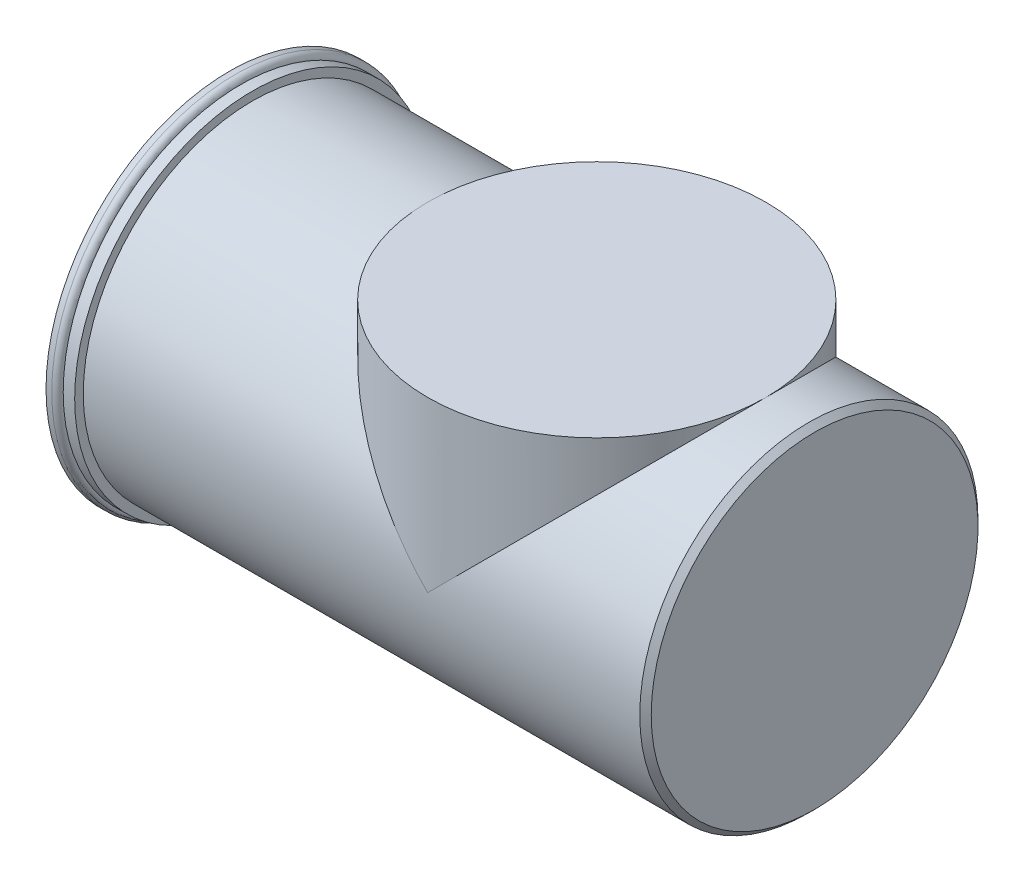
ISO-10303-21;
HEADER;
FILE_DESCRIPTION(('STEP AP214'),'2;1');
FILE_NAME('part.step','',(''),(''),'','','');
FILE_SCHEMA(('AUTOMOTIVE_DESIGN { 1 0 10303 214 1 1 1 1 }'));
ENDSEC;
DATA;
#1=APPLICATION_CONTEXT('core data for automotive mechanical design processes');
#2=APPLICATION_PROTOCOL_DEFINITION('international standard','automotive_design',2000,#1);
#3=PRODUCT_CONTEXT('',#1,'mechanical');
#4=PRODUCT('Part','Part','',(#3));
#5=PRODUCT_RELATED_PRODUCT_CATEGORY('part','',(#4));
#6=PRODUCT_DEFINITION_FORMATION('','',#4);
#7=PRODUCT_DEFINITION_CONTEXT('part definition',#1,'design');
#8=PRODUCT_DEFINITION('design','',#6,#7);
#9=PRODUCT_DEFINITION_SHAPE('','',#8);
#10=(LENGTH_UNIT() NAMED_UNIT(*) SI_UNIT(.MILLI.,.METRE.));
#11=(NAMED_UNIT(*) PLANE_ANGLE_UNIT() SI_UNIT($,.RADIAN.));
#12=(NAMED_UNIT(*) SI_UNIT($,.STERADIAN.) SOLID_ANGLE_UNIT());
#13=UNCERTAINTY_MEASURE_WITH_UNIT(LENGTH_MEASURE(1.E-05),#10,'distance_accuracy_value','');
#14=(GEOMETRIC_REPRESENTATION_CONTEXT(3) GLOBAL_UNCERTAINTY_ASSIGNED_CONTEXT((#13)) GLOBAL_UNIT_ASSIGNED_CONTEXT((#10,
#11,#12)) REPRESENTATION_CONTEXT('',''));
#15=CARTESIAN_POINT('',(0.,0.,0.));
#16=DIRECTION('',(0.,0.,1.));
#17=DIRECTION('',(1.,0.,0.));
#18=AXIS2_PLACEMENT_3D('',#15,#16,#17);
#19=CARTESIAN_POINT('',(-152.589992,0.,0.));
#20=DIRECTION('',(1.,0.,0.));
#21=DIRECTION('',(0.,0.,-1.));
#22=AXIS2_PLACEMENT_3D('',#19,#20,#21);
#23=CYLINDRICAL_SURFACE('',#22,74.93);
#24=CARTESIAN_POINT('',(93.9800000000001,0.,0.));
#25=DIRECTION('',(1.,0.,0.));
#26=DIRECTION('',(0.,0.,-1.));
#27=AXIS2_PLACEMENT_3D('',#24,#25,#26);
#28=CIRCLE('',#27,74.93);
#29=CARTESIAN_POINT('',(93.98,0.,74.93));
#30=VERTEX_POINT('',#29);
#31=EDGE_CURVE('E11',#30,#30,#28,.F.);
#32=ORIENTED_EDGE('',*,*,#31,.T.);
#33=EDGE_LOOP('',(#32));
#34=FACE_BOUND('',#33,.T.);
#35=CARTESIAN_POINT('',(0.,0.,0.));
#36=DIRECTION('',(0.707106781186547,0.707106781186547,0.));
#37=DIRECTION('',(-0.707106781186547,0.707106781186547,0.));
#38=AXIS2_PLACEMENT_3D('',#35,#36,#37);
#39=ELLIPSE('',#38,105.967022228616,74.93);
#40=CARTESIAN_POINT('',(-74.93,74.93,0.));
#41=VERTEX_POINT('',#40);
#42=CARTESIAN_POINT('',(0.,0.,-74.93));
#43=VERTEX_POINT('',#42);
#44=EDGE_CURVE('E57',#41,#43,#39,.F.);
#45=ORIENTED_EDGE('',*,*,#44,.T.);
#46=CARTESIAN_POINT('',(0.,0.,0.));
#47=DIRECTION('',(-0.707106781186547,0.707106781186547,0.));
#48=DIRECTION('',(0.707106781186547,0.707106781186547,0.));
#49=AXIS2_PLACEMENT_3D('',#46,#47,#48);
#50=ELLIPSE('',#49,105.967022228616,74.93);
#51=CARTESIAN_POINT('',(74.93,74.93,0.));
#52=VERTEX_POINT('',#51);
#53=EDGE_CURVE('E83',#43,#52,#50,.F.);
#54=ORIENTED_EDGE('',*,*,#53,.T.);
#55=CARTESIAN_POINT('',(0.,0.,0.));
#56=DIRECTION('',(-0.707106781186547,0.707106781186547,0.));
#57=DIRECTION('',(0.707106781186547,0.707106781186547,0.));
#58=AXIS2_PLACEMENT_3D('',#55,#56,#57);
#59=ELLIPSE('',#58,105.967022228616,74.93);
#60=CARTESIAN_POINT('',(0.,0.,74.93));
#61=VERTEX_POINT('',#60);
#62=EDGE_CURVE('E78',#52,#61,#59,.F.);
#63=ORIENTED_EDGE('',*,*,#62,.T.);
#64=CARTESIAN_POINT('',(0.,0.,0.));
#65=DIRECTION('',(0.707106781186547,0.707106781186547,0.));
#66=DIRECTION('',(-0.707106781186547,0.707106781186547,0.));
#67=AXIS2_PLACEMENT_3D('',#64,#65,#66);
#68=ELLIPSE('',#67,105.967022228616,74.93);
#69=EDGE_CURVE('E62',#61,#41,#68,.F.);
#70=ORIENTED_EDGE('',*,*,#69,.T.);
#71=EDGE_LOOP('',(#45,#54,#63,#70));
#72=FACE_BOUND('',#71,.T.);
#73=CARTESIAN_POINT('',(-152.589992,0.,0.));
#74=DIRECTION('',(-1.,0.,0.));
#75=DIRECTION('',(0.,0.,1.));
#76=AXIS2_PLACEMENT_3D('',#73,#74,#75);
#77=CIRCLE('',#76,74.93);
#78=CARTESIAN_POINT('',(-152.589992,0.,74.93));
#79=VERTEX_POINT('',#78);
#80=EDGE_CURVE('E90',#79,#79,#77,.F.);
#81=ORIENTED_EDGE('',*,*,#80,.T.);
#82=EDGE_LOOP('',(#81));
#83=FACE_BOUND('',#82,.T.);
#84=ADVANCED_FACE('F41',(#34,#72,#83),#23,.T.);
#85=CARTESIAN_POINT('',(96.52,0.,0.));
#86=DIRECTION('',(1.,0.,0.));
#87=DIRECTION('',(0.,0.,-1.));
#88=AXIS2_PLACEMENT_3D('',#85,#86,#87);
#89=PLANE('',#88);
#90=CARTESIAN_POINT('',(96.52,0.,0.));
#91=DIRECTION('',(1.,0.,0.));
#92=DIRECTION('',(0.,0.,-1.));
#93=AXIS2_PLACEMENT_3D('',#90,#91,#92);
#94=CIRCLE('',#93,72.3900000000001);
#95=CARTESIAN_POINT('',(96.52,0.,72.3900000000001));
#96=VERTEX_POINT('',#95);
#97=EDGE_CURVE('E50',#96,#96,#94,.T.);
#98=ORIENTED_EDGE('',*,*,#97,.T.);
#99=EDGE_LOOP('',(#98));
#100=FACE_BOUND('',#99,.T.);
#101=ADVANCED_FACE('F106',(#100),#89,.T.);
#102=CARTESIAN_POINT('',(0.,74.93,0.));
#103=DIRECTION('',(0.,1.,0.));
#104=DIRECTION('',(0.,0.,1.));
#105=AXIS2_PLACEMENT_3D('',#102,#103,#104);
#106=PLANE('',#105);
#107=CARTESIAN_POINT('',(0.,74.93,0.));
#108=DIRECTION('',(0.,1.,0.));
#109=DIRECTION('',(0.,0.,1.));
#110=AXIS2_PLACEMENT_3D('',#107,#108,#109);
#111=CIRCLE('',#110,74.93);
#112=EDGE_CURVE('E70',#41,#52,#111,.T.);
#113=ORIENTED_EDGE('',*,*,#112,.T.);
#114=CARTESIAN_POINT('',(0.,74.93,0.));
#115=DIRECTION('',(0.,1.,0.));
#116=DIRECTION('',(0.,0.,1.));
#117=AXIS2_PLACEMENT_3D('',#114,#115,#116);
#118=CIRCLE('',#117,74.93);
#119=EDGE_CURVE('E74',#52,#41,#118,.T.);
#120=ORIENTED_EDGE('',*,*,#119,.T.);
#121=EDGE_LOOP('',(#113,#120));
#122=FACE_BOUND('',#121,.T.);
#123=ADVANCED_FACE('F72',(#122),#106,.T.);
#124=CARTESIAN_POINT('',(0.,-74.931,0.));
#125=DIRECTION('',(0.,1.,0.));
#126=DIRECTION('',(0.,0.,1.));
#127=AXIS2_PLACEMENT_3D('',#124,#125,#126);
#128=CYLINDRICAL_SURFACE('',#127,74.93);
#129=ORIENTED_EDGE('',*,*,#69,.F.);
#130=ORIENTED_EDGE('',*,*,#62,.F.);
#131=ORIENTED_EDGE('',*,*,#112,.F.);
#132=EDGE_LOOP('',(#129,#130,#131));
#133=FACE_BOUND('',#132,.T.);
#134=ADVANCED_FACE('F79',(#133),#128,.T.);
#135=CARTESIAN_POINT('',(0.,-74.931,0.));
#136=DIRECTION('',(0.,1.,0.));
#137=DIRECTION('',(0.,0.,1.));
#138=AXIS2_PLACEMENT_3D('',#135,#136,#137);
#139=CYLINDRICAL_SURFACE('',#138,74.93);
#140=ORIENTED_EDGE('',*,*,#44,.F.);
#141=ORIENTED_EDGE('',*,*,#119,.F.);
#142=ORIENTED_EDGE('',*,*,#53,.F.);
#143=EDGE_LOOP('',(#140,#141,#142));
#144=FACE_BOUND('',#143,.T.);
#145=ADVANCED_FACE('F88',(#144),#139,.T.);
#146=CARTESIAN_POINT('',(-157.669992,0.,0.));
#147=DIRECTION('',(1.,0.,0.));
#148=DIRECTION('',(0.,0.,-1.));
#149=AXIS2_PLACEMENT_3D('',#146,#147,#148);
#150=CYLINDRICAL_SURFACE('',#149,78.74);
#151=CARTESIAN_POINT('',(-157.669992,0.,0.));
#152=DIRECTION('',(-1.,0.,0.));
#153=DIRECTION('',(0.,0.,1.));
#154=AXIS2_PLACEMENT_3D('',#151,#152,#153);
#155=CIRCLE('',#154,78.74);
#156=CARTESIAN_POINT('',(-157.669992,0.,78.74));
#157=VERTEX_POINT('',#156);
#158=EDGE_CURVE('E94',#157,#157,#155,.T.);
#159=ORIENTED_EDGE('',*,*,#158,.F.);
#160=EDGE_LOOP('',(#159));
#161=FACE_BOUND('',#160,.T.);
#162=CARTESIAN_POINT('',(-152.589992,0.,0.));
#163=DIRECTION('',(-1.,0.,0.));
#164=DIRECTION('',(0.,0.,1.));
#165=AXIS2_PLACEMENT_3D('',#162,#163,#164);
#166=CIRCLE('',#165,78.74);
#167=CARTESIAN_POINT('',(-152.589992,0.,78.74));
#168=VERTEX_POINT('',#167);
#169=EDGE_CURVE('E152',#168,#168,#166,.T.);
#170=ORIENTED_EDGE('',*,*,#169,.T.);
#171=EDGE_LOOP('',(#170));
#172=FACE_BOUND('',#171,.T.);
#173=ADVANCED_FACE('F131',(#161,#172),#150,.T.);
#174=CARTESIAN_POINT('',(-152.589992,0.,0.));
#175=DIRECTION('',(-1.,0.,0.));
#176=DIRECTION('',(0.,0.,1.));
#177=AXIS2_PLACEMENT_3D('',#174,#175,#176);
#178=PLANE('',#177);
#179=ORIENTED_EDGE('',*,*,#80,.F.);
#180=EDGE_LOOP('',(#179));
#181=FACE_BOUND('',#180,.T.);
#182=ORIENTED_EDGE('',*,*,#169,.F.);
#183=EDGE_LOOP('',(#182));
#184=FACE_BOUND('',#183,.T.);
#185=ADVANCED_FACE('F134',(#181,#184),#178,.F.);
#186=CARTESIAN_POINT('',(-162.749992,0.,0.));
#187=DIRECTION('',(1.,0.,0.));
#188=DIRECTION('',(0.,0.,-1.));
#189=AXIS2_PLACEMENT_3D('',#186,#187,#188);
#190=CYLINDRICAL_SURFACE('',#189,81.28);
#191=CARTESIAN_POINT('',(-160.209992,0.,0.));
#192=DIRECTION('',(-1.,0.,0.));
#193=DIRECTION('',(0.,0.,1.));
#194=AXIS2_PLACEMENT_3D('',#191,#192,#193);
#195=CIRCLE('',#194,81.28);
#196=CARTESIAN_POINT('',(-160.209992,0.,81.28));
#197=VERTEX_POINT('',#196);
#198=EDGE_CURVE('E81',#197,#197,#195,.T.);
#199=ORIENTED_EDGE('',*,*,#198,.T.);
#200=EDGE_LOOP('',(#199));
#201=FACE_BOUND('',#200,.T.);
#202=CARTESIAN_POINT('',(-162.749992,0.,0.));
#203=DIRECTION('',(-1.,0.,0.));
#204=DIRECTION('',(0.,0.,1.));
#205=AXIS2_PLACEMENT_3D('',#202,#203,#204);
#206=CIRCLE('',#205,81.28);
#207=CARTESIAN_POINT('',(-162.749992,0.,81.28));
#208=VERTEX_POINT('',#207);
#209=EDGE_CURVE('E149',#208,#208,#206,.T.);
#210=ORIENTED_EDGE('',*,*,#209,.F.);
#211=EDGE_LOOP('',(#210));
#212=FACE_BOUND('',#211,.T.);
#213=ADVANCED_FACE('F138',(#201,#212),#190,.T.);
#214=CARTESIAN_POINT('',(-162.749992,0.,0.));
#215=DIRECTION('',(-1.,0.,0.));
#216=DIRECTION('',(0.,0.,1.));
#217=AXIS2_PLACEMENT_3D('',#214,#215,#216);
#218=PLANE('',#217);
#219=ORIENTED_EDGE('',*,*,#209,.T.);
#220=EDGE_LOOP('',(#219));
#221=FACE_BOUND('',#220,.T.);
#222=ADVANCED_FACE('F114',(#221),#218,.T.);
#223=CARTESIAN_POINT('',(-160.209992,0.,0.));
#224=DIRECTION('',(-1.,0.,0.));
#225=DIRECTION('',(0.,0.,1.));
#226=AXIS2_PLACEMENT_3D('',#223,#224,#225);
#227=TOROIDAL_SURFACE('',#226,78.74,2.54);
#228=ORIENTED_EDGE('',*,*,#158,.T.);
#229=EDGE_LOOP('',(#228));
#230=FACE_BOUND('',#229,.T.);
#231=ORIENTED_EDGE('',*,*,#198,.F.);
#232=EDGE_LOOP('',(#231));
#233=FACE_BOUND('',#232,.T.);
#234=ADVANCED_FACE('F109',(#230,#233),#227,.T.);
#235=CARTESIAN_POINT('',(96.52,0.,0.));
#236=DIRECTION('',(-1.,0.,0.));
#237=DIRECTION('',(0.,0.,1.));
#238=AXIS2_PLACEMENT_3D('',#235,#236,#237);
#239=CONICAL_SURFACE('',#238,72.3900000000001,0.785398163397437);
#240=CARTESIAN_POINT('',(93.98,0.,74.93));
#241=CARTESIAN_POINT('',(94.0064583333334,0.,74.9035416666667));
#242=CARTESIAN_POINT('',(94.0329166666667,0.,74.8770833333333));
#243=CARTESIAN_POINT('',(94.0858333333334,0.,74.8241666666667));
#244=CARTESIAN_POINT('',(94.1122916666667,0.,74.7977083333333));
#245=CARTESIAN_POINT('',(94.1652083333334,0.,74.7447916666667));
#246=CARTESIAN_POINT('',(94.1916666666667,0.,74.7183333333333));
#247=CARTESIAN_POINT('',(94.2445833333334,0.,74.6654166666667));
#248=CARTESIAN_POINT('',(94.2710416666667,0.,74.6389583333333));
#249=CARTESIAN_POINT('',(94.3239583333334,0.,74.5860416666667));
#250=CARTESIAN_POINT('',(94.3504166666667,0.,74.5595833333334));
#251=CARTESIAN_POINT('',(94.4033333333334,0.,74.5066666666667));
#252=CARTESIAN_POINT('',(94.4297916666667,0.,74.4802083333334));
#253=CARTESIAN_POINT('',(94.4827083333334,0.,74.4272916666667));
#254=CARTESIAN_POINT('',(94.5091666666667,0.,74.4008333333334));
#255=CARTESIAN_POINT('',(94.5620833333334,0.,74.3479166666667));
#256=CARTESIAN_POINT('',(94.5885416666667,0.,74.3214583333334));
#257=CARTESIAN_POINT('',(94.6414583333334,0.,74.2685416666667));
#258=CARTESIAN_POINT('',(94.6679166666667,0.,74.2420833333334));
#259=CARTESIAN_POINT('',(94.7208333333334,0.,74.1891666666667));
#260=CARTESIAN_POINT('',(94.7472916666667,0.,74.1627083333334));
#261=CARTESIAN_POINT('',(94.8002083333334,0.,74.1097916666667));
#262=CARTESIAN_POINT('',(94.8266666666667,0.,74.0833333333334));
#263=CARTESIAN_POINT('',(94.8795833333334,0.,74.0304166666667));
#264=CARTESIAN_POINT('',(94.9060416666667,0.,74.0039583333334));
#265=CARTESIAN_POINT('',(94.9589583333334,0.,73.9510416666667));
#266=CARTESIAN_POINT('',(94.9854166666667,0.,73.9245833333334));
#267=CARTESIAN_POINT('',(95.0383333333334,0.,73.8716666666667));
#268=CARTESIAN_POINT('',(95.0647916666667,0.,73.8452083333334));
#269=CARTESIAN_POINT('',(95.1177083333334,0.,73.7922916666667));
#270=CARTESIAN_POINT('',(95.1441666666667,0.,73.7658333333334));
#271=CARTESIAN_POINT('',(95.1970833333334,0.,73.7129166666667));
#272=CARTESIAN_POINT('',(95.2235416666667,0.,73.6864583333334));
#273=CARTESIAN_POINT('',(95.2764583333334,0.,73.6335416666667));
#274=CARTESIAN_POINT('',(95.3029166666667,0.,73.6070833333334));
#275=CARTESIAN_POINT('',(95.3558333333334,0.,73.5541666666667));
#276=CARTESIAN_POINT('',(95.3822916666667,0.,73.5277083333334));
#277=CARTESIAN_POINT('',(95.4352083333333,0.,73.4747916666667));
#278=CARTESIAN_POINT('',(95.4616666666667,0.,73.4483333333334));
#279=CARTESIAN_POINT('',(95.5145833333333,0.,73.3954166666667));
#280=CARTESIAN_POINT('',(95.5410416666667,0.,73.3689583333334));
#281=CARTESIAN_POINT('',(95.5939583333333,0.,73.3160416666667));
#282=CARTESIAN_POINT('',(95.6204166666667,0.,73.2895833333334));
#283=CARTESIAN_POINT('',(95.6733333333333,0.,73.2366666666667));
#284=CARTESIAN_POINT('',(95.6997916666667,0.,73.2102083333334));
#285=CARTESIAN_POINT('',(95.7527083333333,0.,73.1572916666668));
#286=CARTESIAN_POINT('',(95.7791666666667,0.,73.1308333333334));
#287=CARTESIAN_POINT('',(95.8320833333333,0.,73.0779166666668));
#288=CARTESIAN_POINT('',(95.8585416666667,0.,73.0514583333334));
#289=CARTESIAN_POINT('',(95.9114583333333,0.,72.9985416666668));
#290=CARTESIAN_POINT('',(95.9379166666667,0.,72.9720833333334));
#291=CARTESIAN_POINT('',(95.9908333333333,0.,72.9191666666668));
#292=CARTESIAN_POINT('',(96.0172916666667,0.,72.8927083333334));
#293=CARTESIAN_POINT('',(96.0702083333333,0.,72.8397916666668));
#294=CARTESIAN_POINT('',(96.0966666666667,0.,72.8133333333334));
#295=CARTESIAN_POINT('',(96.1495833333333,0.,72.7604166666668));
#296=CARTESIAN_POINT('',(96.1760416666667,0.,72.7339583333334));
#297=CARTESIAN_POINT('',(96.2289583333333,0.,72.6810416666668));
#298=CARTESIAN_POINT('',(96.2554166666666,0.,72.6545833333334));
#299=CARTESIAN_POINT('',(96.3083333333333,0.,72.6016666666668));
#300=CARTESIAN_POINT('',(96.3347916666667,0.,72.5752083333334));
#301=CARTESIAN_POINT('',(96.3877083333333,0.,72.5222916666668));
#302=CARTESIAN_POINT('',(96.4141666666667,0.,72.4958333333335));
#303=CARTESIAN_POINT('',(96.4670833333333,0.,72.4429166666668));
#304=CARTESIAN_POINT('',(96.4935416666667,0.,72.4164583333335));
#305=CARTESIAN_POINT('',(96.52,0.,72.3900000000001));
#306=B_SPLINE_CURVE_WITH_KNOTS('',3,(#240,#241,#242,#243,#244,#245,#246,#247,#248,#249,#250,
#251,#252,#253,#254,#255,#256,#257,#258,#259,#260,#261,#262,#263,#264,#265,#266,#267,#268,#269,
#270,#271,#272,#273,#274,#275,#276,#277,#278,#279,#280,#281,#282,#283,#284,#285,#286,#287,#288,
#289,#290,#291,#292,#293,#294,#295,#296,#297,#298,#299,#300,#301,#302,#303,#304,#305),
.UNSPECIFIED.,.F.,.F.,(4,2,2,2,2,2,2,2,2,2,2,2,2,2,2,2,2,2,2,2,2,2,2,2,2,2,2,2,2,2,2,2,4),(0.,
0.112253201513374,0.224506403026728,0.336759604540092,0.449012806053446,0.561266007566809,
0.673519209080173,0.785772410593527,0.898025612106881,1.01027881362025,1.12253201513361,
1.23478521664697,1.34703841816033,1.45929161967369,1.57154482118705,1.68379802270041,
1.79605122421376,1.90830442572714,2.02055762724049,2.13281082875385,2.24506403026721,
2.35731723178057,2.46957043329394,2.58182363480729,2.69407683632064,2.80633003783402,
2.91858323934737,3.03083644086073,3.14308964237409,3.25534284388745,3.36759604540082,
3.47984924691417,3.59210244842754),.UNSPECIFIED.);
#307=EDGE_CURVE('BSEAM43',#30,#96,#306,.T.);
#308=ORIENTED_EDGE('',*,*,#31,.F.);
#309=ORIENTED_EDGE('',*,*,#97,.F.);
#310=ORIENTED_EDGE('',*,*,#307,.T.);
#311=ORIENTED_EDGE('',*,*,#307,.F.);
#312=EDGE_LOOP('',(#308,#310,#309,#311));
#313=FACE_BOUND('',#312,.T.);
#314=ADVANCED_FACE('F43',(#313),#239,.T.);
#315=CLOSED_SHELL('',(#84,#101,#123,#134,#145,#173,#185,#213,#222,#234,#314));
#316=MANIFOLD_SOLID_BREP('B2',#315);
#317=ADVANCED_BREP_SHAPE_REPRESENTATION('',(#18,#316),#14);
#318=SHAPE_DEFINITION_REPRESENTATION(#9,#317);
ENDSEC;
END-ISO-10303-21;
